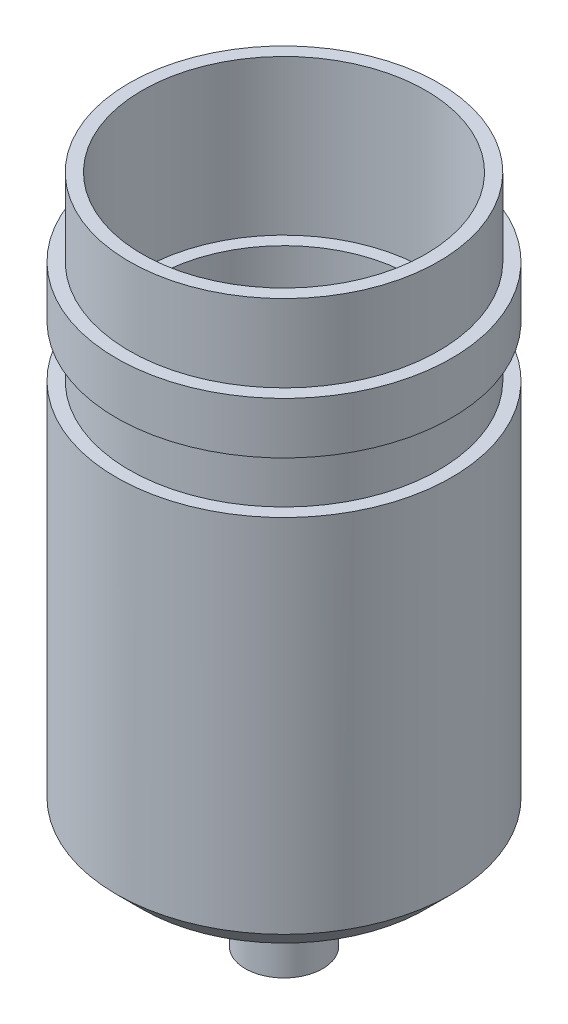
ISO-10303-21;
HEADER;
FILE_DESCRIPTION(('STEP AP214'),'2;1');
FILE_NAME('part.step','',(''),(''),'','','');
FILE_SCHEMA(('AUTOMOTIVE_DESIGN { 1 0 10303 214 1 1 1 1 }'));
ENDSEC;
DATA;
#1=APPLICATION_CONTEXT('core data for automotive mechanical design processes');
#2=APPLICATION_PROTOCOL_DEFINITION('international standard','automotive_design',2000,#1);
#3=PRODUCT_CONTEXT('',#1,'mechanical');
#4=PRODUCT('Part','Part','',(#3));
#5=PRODUCT_RELATED_PRODUCT_CATEGORY('part','',(#4));
#6=PRODUCT_DEFINITION_FORMATION('','',#4);
#7=PRODUCT_DEFINITION_CONTEXT('part definition',#1,'design');
#8=PRODUCT_DEFINITION('design','',#6,#7);
#9=PRODUCT_DEFINITION_SHAPE('','',#8);
#10=(LENGTH_UNIT() NAMED_UNIT(*) SI_UNIT(.MILLI.,.METRE.));
#11=(NAMED_UNIT(*) PLANE_ANGLE_UNIT() SI_UNIT($,.RADIAN.));
#12=(NAMED_UNIT(*) SI_UNIT($,.STERADIAN.) SOLID_ANGLE_UNIT());
#13=UNCERTAINTY_MEASURE_WITH_UNIT(LENGTH_MEASURE(1.E-05),#10,'distance_accuracy_value','');
#14=(GEOMETRIC_REPRESENTATION_CONTEXT(3) GLOBAL_UNCERTAINTY_ASSIGNED_CONTEXT((#13)) GLOBAL_UNIT_ASSIGNED_CONTEXT((#10,
#11,#12)) REPRESENTATION_CONTEXT('',''));
#15=CARTESIAN_POINT('',(0.,0.,0.));
#16=DIRECTION('',(0.,0.,1.));
#17=DIRECTION('',(1.,0.,0.));
#18=AXIS2_PLACEMENT_3D('',#15,#16,#17);
#19=CARTESIAN_POINT('',(0.,4.499999777733,0.));
#20=DIRECTION('',(0.,1.,0.));
#21=DIRECTION('',(0.,0.,-1.));
#22=AXIS2_PLACEMENT_3D('',#19,#20,#21);
#23=CONICAL_SURFACE('',#22,6.000000932791,0.785398259652182);
#24=CARTESIAN_POINT('',(0.,5.000000809033,0.));
#25=DIRECTION('',(0.,1.,0.));
#26=DIRECTION('',(1.,0.,0.));
#27=AXIS2_PLACEMENT_3D('',#24,#25,#26);
#28=CIRCLE('',#27,6.5);
#29=CARTESIAN_POINT('',(0.,4.99999977886003,6.50000103017277));
#30=VERTEX_POINT('',#29);
#31=CARTESIAN_POINT('',(-6.5,5.000000809033,0.));
#32=VERTEX_POINT('',#31);
#33=EDGE_CURVE('E28',#30,#32,#28,.T.);
#34=ORIENTED_EDGE('',*,*,#33,.F.);
#35=DIRECTION('',(0.,-0.707106713124169,-0.707106849248919));
#36=VECTOR('',#35,1.);
#37=CARTESIAN_POINT('',(0.,4.499999777733,6.000000932791));
#38=LINE('',#37,#36);
#39=CARTESIAN_POINT('',(0.,3.99999913240693,5.50000019121007));
#40=VERTEX_POINT('',#39);
#41=EDGE_CURVE('E11',#30,#40,#38,.T.);
#42=ORIENTED_EDGE('',*,*,#41,.T.);
#43=CARTESIAN_POINT('',(0.,3.999999132407,0.));
#44=DIRECTION('',(0.,1.,0.));
#45=DIRECTION('',(1.,0.,0.));
#46=AXIS2_PLACEMENT_3D('',#43,#44,#45);
#47=CIRCLE('',#46,5.50000019121);
#48=EDGE_CURVE('E106',#40,#40,#47,.T.);
#49=ORIENTED_EDGE('',*,*,#48,.T.);
#50=ORIENTED_EDGE('',*,*,#41,.F.);
#51=CARTESIAN_POINT('',(0.,5.000000809033,0.));
#52=DIRECTION('',(0.,1.,0.));
#53=DIRECTION('',(1.,0.,0.));
#54=AXIS2_PLACEMENT_3D('',#51,#52,#53);
#55=CIRCLE('',#54,6.5);
#56=EDGE_CURVE('E108',#32,#30,#55,.T.);
#57=ORIENTED_EDGE('',*,*,#56,.F.);
#58=EDGE_LOOP('',(#34,#42,#49,#50,#57));
#59=FACE_BOUND('',#58,.T.);
#60=ADVANCED_FACE('F17',(#59),#23,.T.);
#61=CARTESIAN_POINT('',(0.,-1.3,0.));
#62=DIRECTION('',(0.,1.,0.));
#63=DIRECTION('',(1.,0.,0.));
#64=AXIS2_PLACEMENT_3D('',#61,#62,#63);
#65=CYLINDRICAL_SURFACE('',#64,6.5);
#66=CARTESIAN_POINT('',(0.,19.,0.));
#67=DIRECTION('',(0.,1.,0.));
#68=DIRECTION('',(1.,0.,0.));
#69=AXIS2_PLACEMENT_3D('',#66,#67,#68);
#70=CIRCLE('',#69,6.5);
#71=CARTESIAN_POINT('',(-6.5,19.,0.));
#72=VERTEX_POINT('',#71);
#73=EDGE_CURVE('E118',#72,#72,#70,.T.);
#74=ORIENTED_EDGE('',*,*,#73,.F.);
#75=DIRECTION('',(0.,-1.,0.));
#76=VECTOR('',#75,1.);
#77=CARTESIAN_POINT('',(-6.5,-1.3,0.));
#78=LINE('',#77,#76);
#79=EDGE_CURVE('E75',#72,#32,#78,.T.);
#80=ORIENTED_EDGE('',*,*,#79,.T.);
#81=ORIENTED_EDGE('',*,*,#56,.T.);
#82=ORIENTED_EDGE('',*,*,#33,.T.);
#83=ORIENTED_EDGE('',*,*,#79,.F.);
#84=EDGE_LOOP('',(#74,#80,#81,#82,#83));
#85=FACE_BOUND('',#84,.T.);
#86=ADVANCED_FACE('F111',(#85),#65,.T.);
#87=CARTESIAN_POINT('',(0.,19.,0.));
#88=DIRECTION('',(0.,1.,0.));
#89=DIRECTION('',(1.,0.,0.));
#90=AXIS2_PLACEMENT_3D('',#87,#88,#89);
#91=PLANE('',#90);
#92=CARTESIAN_POINT('',(0.,19.,0.));
#93=DIRECTION('',(0.,1.,0.));
#94=DIRECTION('',(1.,0.,0.));
#95=AXIS2_PLACEMENT_3D('',#92,#93,#94);
#96=CIRCLE('',#95,6.);
#97=CARTESIAN_POINT('',(-6.,19.,0.));
#98=VERTEX_POINT('',#97);
#99=EDGE_CURVE('E86',#98,#98,#96,.T.);
#100=ORIENTED_EDGE('',*,*,#99,.F.);
#101=EDGE_LOOP('',(#100));
#102=FACE_BOUND('',#101,.T.);
#103=ORIENTED_EDGE('',*,*,#73,.T.);
#104=EDGE_LOOP('',(#103));
#105=FACE_BOUND('',#104,.T.);
#106=ADVANCED_FACE('F219',(#102,#105),#91,.T.);
#107=CARTESIAN_POINT('',(0.,-1.3,0.));
#108=DIRECTION('',(0.,1.,0.));
#109=DIRECTION('',(1.,0.,0.));
#110=AXIS2_PLACEMENT_3D('',#107,#108,#109);
#111=CYLINDRICAL_SURFACE('',#110,6.);
#112=CARTESIAN_POINT('',(0.,21.,0.));
#113=DIRECTION('',(0.,1.,0.));
#114=DIRECTION('',(1.,0.,0.));
#115=AXIS2_PLACEMENT_3D('',#112,#113,#114);
#116=CIRCLE('',#115,6.);
#117=CARTESIAN_POINT('',(-6.,21.,0.));
#118=VERTEX_POINT('',#117);
#119=EDGE_CURVE('E162',#118,#118,#116,.T.);
#120=ORIENTED_EDGE('',*,*,#119,.F.);
#121=DIRECTION('',(0.,-1.,0.));
#122=VECTOR('',#121,1.);
#123=CARTESIAN_POINT('',(-6.,-1.3,0.));
#124=LINE('',#123,#122);
#125=EDGE_CURVE('E252',#118,#98,#124,.T.);
#126=ORIENTED_EDGE('',*,*,#125,.T.);
#127=ORIENTED_EDGE('',*,*,#99,.T.);
#128=ORIENTED_EDGE('',*,*,#125,.F.);
#129=EDGE_LOOP('',(#120,#126,#127,#128));
#130=FACE_BOUND('',#129,.T.);
#131=ADVANCED_FACE('F19',(#130),#111,.T.);
#132=CARTESIAN_POINT('',(0.,21.,0.));
#133=DIRECTION('',(0.,1.,0.));
#134=DIRECTION('',(1.,0.,0.));
#135=AXIS2_PLACEMENT_3D('',#132,#133,#134);
#136=PLANE('',#135);
#137=ORIENTED_EDGE('',*,*,#119,.T.);
#138=EDGE_LOOP('',(#137));
#139=FACE_BOUND('',#138,.T.);
#140=CARTESIAN_POINT('',(0.,21.,0.));
#141=DIRECTION('',(0.,1.,0.));
#142=DIRECTION('',(1.,0.,0.));
#143=AXIS2_PLACEMENT_3D('',#140,#141,#142);
#144=CIRCLE('',#143,6.5);
#145=CARTESIAN_POINT('',(-6.5,21.,0.));
#146=VERTEX_POINT('',#145);
#147=EDGE_CURVE('E159',#146,#146,#144,.T.);
#148=ORIENTED_EDGE('',*,*,#147,.F.);
#149=EDGE_LOOP('',(#148));
#150=FACE_BOUND('',#149,.T.);
#151=ADVANCED_FACE('F209',(#139,#150),#136,.F.);
#152=CARTESIAN_POINT('',(0.,-1.3,0.));
#153=DIRECTION('',(0.,1.,0.));
#154=DIRECTION('',(1.,0.,0.));
#155=AXIS2_PLACEMENT_3D('',#152,#153,#154);
#156=CYLINDRICAL_SURFACE('',#155,6.5);
#157=CARTESIAN_POINT('',(0.,23.,0.));
#158=DIRECTION('',(0.,1.,0.));
#159=DIRECTION('',(1.,0.,0.));
#160=AXIS2_PLACEMENT_3D('',#157,#158,#159);
#161=CIRCLE('',#160,6.5);
#162=CARTESIAN_POINT('',(-6.5,23.,0.));
#163=VERTEX_POINT('',#162);
#164=EDGE_CURVE('E151',#163,#163,#161,.T.);
#165=ORIENTED_EDGE('',*,*,#164,.F.);
#166=DIRECTION('',(0.,-1.,0.));
#167=VECTOR('',#166,1.);
#168=CARTESIAN_POINT('',(-6.5,-1.3,0.));
#169=LINE('',#168,#167);
#170=EDGE_CURVE('E155',#163,#146,#169,.T.);
#171=ORIENTED_EDGE('',*,*,#170,.T.);
#172=ORIENTED_EDGE('',*,*,#147,.T.);
#173=ORIENTED_EDGE('',*,*,#170,.F.);
#174=EDGE_LOOP('',(#165,#171,#172,#173));
#175=FACE_BOUND('',#174,.T.);
#176=ADVANCED_FACE('F202',(#175),#156,.T.);
#177=CARTESIAN_POINT('',(0.,23.,0.));
#178=DIRECTION('',(0.,1.,0.));
#179=DIRECTION('',(1.,0.,0.));
#180=AXIS2_PLACEMENT_3D('',#177,#178,#179);
#181=PLANE('',#180);
#182=CARTESIAN_POINT('',(0.,23.,0.));
#183=DIRECTION('',(0.,1.,0.));
#184=DIRECTION('',(1.,0.,0.));
#185=AXIS2_PLACEMENT_3D('',#182,#183,#184);
#186=CIRCLE('',#185,6.);
#187=CARTESIAN_POINT('',(-6.,23.,0.));
#188=VERTEX_POINT('',#187);
#189=EDGE_CURVE('E156',#188,#188,#186,.T.);
#190=ORIENTED_EDGE('',*,*,#189,.F.);
#191=EDGE_LOOP('',(#190));
#192=FACE_BOUND('',#191,.T.);
#193=ORIENTED_EDGE('',*,*,#164,.T.);
#194=EDGE_LOOP('',(#193));
#195=FACE_BOUND('',#194,.T.);
#196=ADVANCED_FACE('F199',(#192,#195),#181,.T.);
#197=CARTESIAN_POINT('',(0.,-1.3,0.));
#198=DIRECTION('',(0.,1.,0.));
#199=DIRECTION('',(1.,0.,0.));
#200=AXIS2_PLACEMENT_3D('',#197,#198,#199);
#201=CYLINDRICAL_SURFACE('',#200,6.);
#202=CARTESIAN_POINT('',(0.,26.,0.));
#203=DIRECTION('',(0.,1.,0.));
#204=DIRECTION('',(1.,0.,0.));
#205=AXIS2_PLACEMENT_3D('',#202,#203,#204);
#206=CIRCLE('',#205,6.);
#207=CARTESIAN_POINT('',(-6.,26.,0.));
#208=VERTEX_POINT('',#207);
#209=EDGE_CURVE('E136',#208,#208,#206,.T.);
#210=ORIENTED_EDGE('',*,*,#209,.F.);
#211=DIRECTION('',(0.,-1.,0.));
#212=VECTOR('',#211,1.);
#213=CARTESIAN_POINT('',(-6.,-1.3,0.));
#214=LINE('',#213,#212);
#215=EDGE_CURVE('E140',#208,#188,#214,.T.);
#216=ORIENTED_EDGE('',*,*,#215,.T.);
#217=ORIENTED_EDGE('',*,*,#189,.T.);
#218=ORIENTED_EDGE('',*,*,#215,.F.);
#219=EDGE_LOOP('',(#210,#216,#217,#218));
#220=FACE_BOUND('',#219,.T.);
#221=ADVANCED_FACE('F197',(#220),#201,.T.);
#222=CARTESIAN_POINT('',(0.,26.,0.));
#223=DIRECTION('',(0.,1.,0.));
#224=DIRECTION('',(1.,0.,0.));
#225=AXIS2_PLACEMENT_3D('',#222,#223,#224);
#226=PLANE('',#225);
#227=CARTESIAN_POINT('',(0.,26.,0.));
#228=DIRECTION('',(0.,-1.,0.));
#229=DIRECTION('',(1.,0.,0.));
#230=AXIS2_PLACEMENT_3D('',#227,#228,#229);
#231=CIRCLE('',#230,5.5);
#232=CARTESIAN_POINT('',(-5.5,26.,0.));
#233=VERTEX_POINT('',#232);
#234=EDGE_CURVE('E124',#233,#233,#231,.T.);
#235=ORIENTED_EDGE('',*,*,#234,.T.);
#236=EDGE_LOOP('',(#235));
#237=FACE_BOUND('',#236,.T.);
#238=ORIENTED_EDGE('',*,*,#209,.T.);
#239=EDGE_LOOP('',(#238));
#240=FACE_BOUND('',#239,.T.);
#241=ADVANCED_FACE('F230',(#237,#240),#226,.T.);
#242=CARTESIAN_POINT('',(0.,26.,0.));
#243=DIRECTION('',(0.,-1.,0.));
#244=DIRECTION('',(1.,0.,0.));
#245=AXIS2_PLACEMENT_3D('',#242,#243,#244);
#246=CYLINDRICAL_SURFACE('',#245,5.5);
#247=ORIENTED_EDGE('',*,*,#234,.F.);
#248=DIRECTION('',(0.,-1.,0.));
#249=VECTOR('',#248,1.);
#250=CARTESIAN_POINT('',(-5.5,26.,0.));
#251=LINE('',#250,#249);
#252=CARTESIAN_POINT('',(-5.5,20.,0.));
#253=VERTEX_POINT('',#252);
#254=EDGE_CURVE('E128',#233,#253,#251,.T.);
#255=ORIENTED_EDGE('',*,*,#254,.T.);
#256=CARTESIAN_POINT('',(0.,20.,0.));
#257=DIRECTION('',(0.,-1.,0.));
#258=DIRECTION('',(1.,0.,0.));
#259=AXIS2_PLACEMENT_3D('',#256,#257,#258);
#260=CIRCLE('',#259,5.5);
#261=EDGE_CURVE('E129',#253,#253,#260,.T.);
#262=ORIENTED_EDGE('',*,*,#261,.T.);
#263=ORIENTED_EDGE('',*,*,#254,.F.);
#264=EDGE_LOOP('',(#247,#255,#262,#263));
#265=FACE_BOUND('',#264,.T.);
#266=ADVANCED_FACE('F233',(#265),#246,.F.);
#267=CARTESIAN_POINT('',(0.,20.,0.));
#268=DIRECTION('',(0.,-1.,0.));
#269=DIRECTION('',(0.,0.,-1.));
#270=AXIS2_PLACEMENT_3D('',#267,#268,#269);
#271=PLANE('',#270);
#272=CARTESIAN_POINT('',(0.,20.,0.));
#273=DIRECTION('',(0.,1.,0.));
#274=DIRECTION('',(1.,0.,0.));
#275=AXIS2_PLACEMENT_3D('',#272,#273,#274);
#276=CIRCLE('',#275,5.);
#277=CARTESIAN_POINT('',(-5.,20.,0.));
#278=VERTEX_POINT('',#277);
#279=EDGE_CURVE('E150',#278,#278,#276,.T.);
#280=ORIENTED_EDGE('',*,*,#279,.F.);
#281=EDGE_LOOP('',(#280));
#282=FACE_BOUND('',#281,.T.);
#283=ORIENTED_EDGE('',*,*,#261,.F.);
#284=EDGE_LOOP('',(#283));
#285=FACE_BOUND('',#284,.T.);
#286=ADVANCED_FACE('F287',(#282,#285),#271,.F.);
#287=CARTESIAN_POINT('',(0.,-1.3,0.));
#288=DIRECTION('',(0.,1.,0.));
#289=DIRECTION('',(1.,0.,0.));
#290=AXIS2_PLACEMENT_3D('',#287,#288,#289);
#291=CYLINDRICAL_SURFACE('',#290,5.);
#292=CARTESIAN_POINT('',(0.,6.,0.));
#293=DIRECTION('',(0.,1.,0.));
#294=DIRECTION('',(1.,0.,0.));
#295=AXIS2_PLACEMENT_3D('',#292,#293,#294);
#296=CIRCLE('',#295,5.);
#297=CARTESIAN_POINT('',(-5.,6.,0.));
#298=VERTEX_POINT('',#297);
#299=EDGE_CURVE('E21',#298,#298,#296,.T.);
#300=ORIENTED_EDGE('',*,*,#299,.F.);
#301=DIRECTION('',(0.,1.,0.));
#302=VECTOR('',#301,1.);
#303=CARTESIAN_POINT('',(-5.,-1.3,0.));
#304=LINE('',#303,#302);
#305=EDGE_CURVE('E122',#298,#278,#304,.T.);
#306=ORIENTED_EDGE('',*,*,#305,.T.);
#307=ORIENTED_EDGE('',*,*,#279,.T.);
#308=ORIENTED_EDGE('',*,*,#305,.F.);
#309=EDGE_LOOP('',(#300,#306,#307,#308));
#310=FACE_BOUND('',#309,.T.);
#311=ADVANCED_FACE('F239',(#310),#291,.F.);
#312=CARTESIAN_POINT('',(0.,5.430607966084,0.));
#313=DIRECTION('',(0.,1.,0.));
#314=DIRECTION('',(1.,0.,0.));
#315=AXIS2_PLACEMENT_3D('',#312,#313,#314);
#316=CONICAL_SURFACE('',#315,2.875,1.30899693899575);
#317=CARTESIAN_POINT('',(0.,4.861215932168,0.));
#318=DIRECTION('',(0.,1.,0.));
#319=DIRECTION('',(1.,0.,0.));
#320=AXIS2_PLACEMENT_3D('',#317,#318,#319);
#321=CIRCLE('',#320,0.75);
#322=CARTESIAN_POINT('',(-0.75,4.861215932168,0.));
#323=VERTEX_POINT('',#322);
#324=EDGE_CURVE('E133',#323,#323,#321,.T.);
#325=ORIENTED_EDGE('',*,*,#324,.F.);
#326=DIRECTION('',(-0.965925826289068,0.258819045102521,0.));
#327=VECTOR('',#326,1.);
#328=CARTESIAN_POINT('',(-2.875,5.430607966084,0.));
#329=LINE('',#328,#327);
#330=EDGE_CURVE('E262',#323,#298,#329,.T.);
#331=ORIENTED_EDGE('',*,*,#330,.T.);
#332=ORIENTED_EDGE('',*,*,#299,.T.);
#333=ORIENTED_EDGE('',*,*,#330,.F.);
#334=EDGE_LOOP('',(#325,#331,#332,#333));
#335=FACE_BOUND('',#334,.T.);
#336=ADVANCED_FACE('F235',(#335),#316,.F.);
#337=CARTESIAN_POINT('',(0.,-1.3,0.));
#338=DIRECTION('',(0.,1.,0.));
#339=DIRECTION('',(1.,0.,0.));
#340=AXIS2_PLACEMENT_3D('',#337,#338,#339);
#341=CYLINDRICAL_SURFACE('',#340,0.75);
#342=CARTESIAN_POINT('',(0.,0.,0.));
#343=DIRECTION('',(0.,1.,0.));
#344=DIRECTION('',(1.,0.,0.));
#345=AXIS2_PLACEMENT_3D('',#342,#343,#344);
#346=CIRCLE('',#345,0.75);
#347=CARTESIAN_POINT('',(-0.75,0.,0.));
#348=VERTEX_POINT('',#347);
#349=EDGE_CURVE('E134',#348,#348,#346,.T.);
#350=ORIENTED_EDGE('',*,*,#349,.F.);
#351=DIRECTION('',(0.,1.,0.));
#352=VECTOR('',#351,1.);
#353=CARTESIAN_POINT('',(-0.75,-1.3,0.));
#354=LINE('',#353,#352);
#355=EDGE_CURVE('E130',#348,#323,#354,.T.);
#356=ORIENTED_EDGE('',*,*,#355,.T.);
#357=ORIENTED_EDGE('',*,*,#324,.T.);
#358=ORIENTED_EDGE('',*,*,#355,.F.);
#359=EDGE_LOOP('',(#350,#356,#357,#358));
#360=FACE_BOUND('',#359,.T.);
#361=ADVANCED_FACE('F238',(#360),#341,.F.);
#362=CARTESIAN_POINT('',(0.,0.,0.));
#363=DIRECTION('',(0.,1.,0.));
#364=DIRECTION('',(1.,0.,0.));
#365=AXIS2_PLACEMENT_3D('',#362,#363,#364);
#366=PLANE('',#365);
#367=ORIENTED_EDGE('',*,*,#349,.T.);
#368=EDGE_LOOP('',(#367));
#369=FACE_BOUND('',#368,.T.);
#370=CARTESIAN_POINT('',(0.,0.,0.));
#371=DIRECTION('',(0.,1.,0.));
#372=DIRECTION('',(1.,0.,0.));
#373=AXIS2_PLACEMENT_3D('',#370,#371,#372);
#374=CIRCLE('',#373,1.5);
#375=CARTESIAN_POINT('',(-1.5,0.,0.));
#376=VERTEX_POINT('',#375);
#377=EDGE_CURVE('E145',#376,#376,#374,.T.);
#378=ORIENTED_EDGE('',*,*,#377,.F.);
#379=EDGE_LOOP('',(#378));
#380=FACE_BOUND('',#379,.T.);
#381=ADVANCED_FACE('F243',(#369,#380),#366,.F.);
#382=CARTESIAN_POINT('',(0.,-1.3,0.));
#383=DIRECTION('',(0.,1.,0.));
#384=DIRECTION('',(1.,0.,0.));
#385=AXIS2_PLACEMENT_3D('',#382,#383,#384);
#386=CYLINDRICAL_SURFACE('',#385,1.5);
#387=CARTESIAN_POINT('',(0.,4.,0.));
#388=DIRECTION('',(0.,1.,0.));
#389=DIRECTION('',(1.,0.,0.));
#390=AXIS2_PLACEMENT_3D('',#387,#388,#389);
#391=CIRCLE('',#390,1.5);
#392=CARTESIAN_POINT('',(-1.5,4.,0.));
#393=VERTEX_POINT('',#392);
#394=EDGE_CURVE('E146',#393,#393,#391,.T.);
#395=ORIENTED_EDGE('',*,*,#394,.F.);
#396=DIRECTION('',(0.,-1.,0.));
#397=VECTOR('',#396,1.);
#398=CARTESIAN_POINT('',(-1.5,-1.3,0.));
#399=LINE('',#398,#397);
#400=EDGE_CURVE('E141',#393,#376,#399,.T.);
#401=ORIENTED_EDGE('',*,*,#400,.T.);
#402=ORIENTED_EDGE('',*,*,#377,.T.);
#403=ORIENTED_EDGE('',*,*,#400,.F.);
#404=EDGE_LOOP('',(#395,#401,#402,#403));
#405=FACE_BOUND('',#404,.T.);
#406=ADVANCED_FACE('F229',(#405),#386,.T.);
#407=CARTESIAN_POINT('',(0.,4.,0.));
#408=DIRECTION('',(0.,1.,0.));
#409=DIRECTION('',(1.,0.,0.));
#410=AXIS2_PLACEMENT_3D('',#407,#408,#409);
#411=PLANE('',#410);
#412=ORIENTED_EDGE('',*,*,#394,.T.);
#413=EDGE_LOOP('',(#412));
#414=FACE_BOUND('',#413,.T.);
#415=ORIENTED_EDGE('',*,*,#48,.F.);
#416=EDGE_LOOP('',(#415));
#417=FACE_BOUND('',#416,.T.);
#418=ADVANCED_FACE('F330',(#414,#417),#411,.F.);
#419=CLOSED_SHELL('',(#60,#86,#106,#131,#151,#176,#196,#221,#241,#266,#286,#311,#336,#361,#381,
#406,#418));
#420=MANIFOLD_SOLID_BREP('B1',#419);
#421=ADVANCED_BREP_SHAPE_REPRESENTATION('',(#18,#420),#14);
#422=SHAPE_DEFINITION_REPRESENTATION(#9,#421);
ENDSEC;
END-ISO-10303-21;
